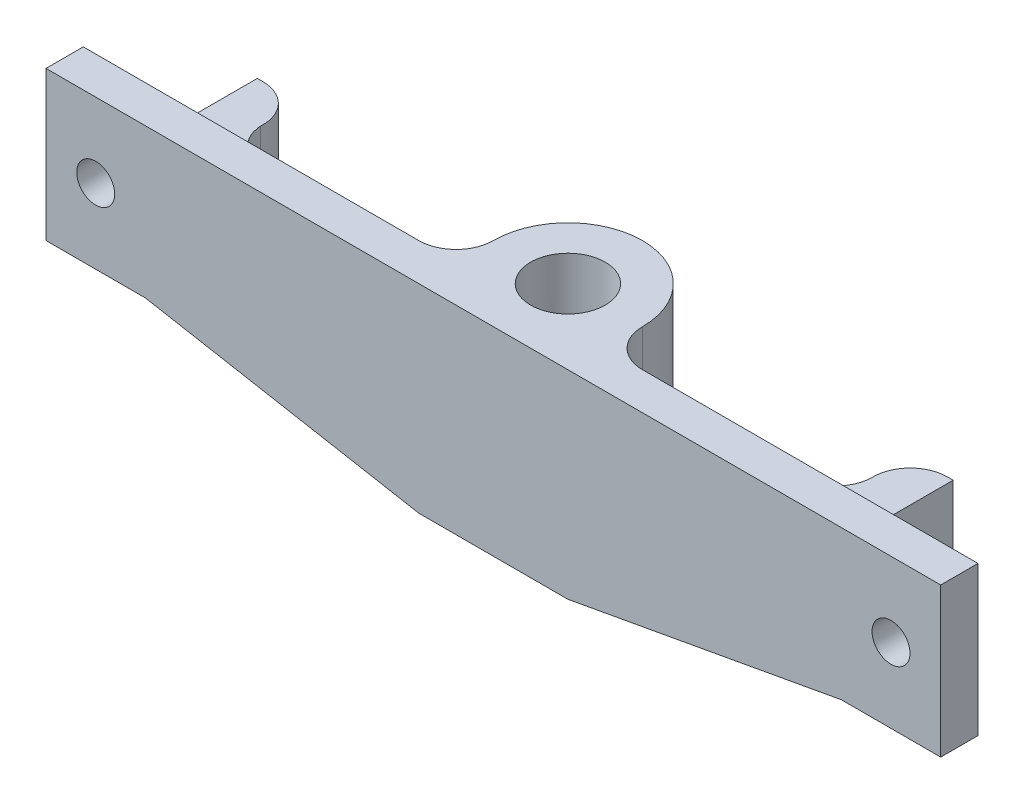
ISO-10303-21;
HEADER;
FILE_DESCRIPTION(('STEP AP214'),'2;1');
FILE_NAME('part.step','',(''),(''),'','','');
FILE_SCHEMA(('AUTOMOTIVE_DESIGN { 1 0 10303 214 1 1 1 1 }'));
ENDSEC;
DATA;
#1=APPLICATION_CONTEXT('core data for automotive mechanical design processes');
#2=APPLICATION_PROTOCOL_DEFINITION('international standard','automotive_design',2000,#1);
#3=PRODUCT_CONTEXT('',#1,'mechanical');
#4=PRODUCT('Part','Part','',(#3));
#5=PRODUCT_RELATED_PRODUCT_CATEGORY('part','',(#4));
#6=PRODUCT_DEFINITION_FORMATION('','',#4);
#7=PRODUCT_DEFINITION_CONTEXT('part definition',#1,'design');
#8=PRODUCT_DEFINITION('design','',#6,#7);
#9=PRODUCT_DEFINITION_SHAPE('','',#8);
#10=(LENGTH_UNIT() NAMED_UNIT(*) SI_UNIT(.MILLI.,.METRE.));
#11=(NAMED_UNIT(*) PLANE_ANGLE_UNIT() SI_UNIT($,.RADIAN.));
#12=(NAMED_UNIT(*) SI_UNIT($,.STERADIAN.) SOLID_ANGLE_UNIT());
#13=UNCERTAINTY_MEASURE_WITH_UNIT(LENGTH_MEASURE(1.E-05),#10,'distance_accuracy_value','');
#14=(GEOMETRIC_REPRESENTATION_CONTEXT(3) GLOBAL_UNCERTAINTY_ASSIGNED_CONTEXT((#13)) GLOBAL_UNIT_ASSIGNED_CONTEXT((#10,
#11,#12)) REPRESENTATION_CONTEXT('',''));
#15=CARTESIAN_POINT('',(0.,0.,0.));
#16=DIRECTION('',(0.,0.,1.));
#17=DIRECTION('',(1.,0.,0.));
#18=AXIS2_PLACEMENT_3D('',#15,#16,#17);
#19=CARTESIAN_POINT('',(0.,0.,0.));
#20=DIRECTION('',(0.,0.,-1.));
#21=DIRECTION('',(-1.,0.,0.));
#22=AXIS2_PLACEMENT_3D('',#19,#20,#21);
#23=PLANE('',#22);
#24=CARTESIAN_POINT('',(-50.8,-9.52499999999999,0.));
#25=DIRECTION('',(0.,0.,-1.));
#26=DIRECTION('',(-1.,0.,0.));
#27=AXIS2_PLACEMENT_3D('',#24,#25,#26);
#28=CIRCLE('',#27,2.4257);
#29=CARTESIAN_POINT('',(-53.2257,-9.52499999999999,0.));
#30=VERTEX_POINT('',#29);
#31=EDGE_CURVE('E282',#30,#30,#28,.T.);
#32=ORIENTED_EDGE('',*,*,#31,.F.);
#33=EDGE_LOOP('',(#32));
#34=FACE_BOUND('',#33,.T.);
#35=DIRECTION('',(-1.,0.,0.));
#36=VECTOR('',#35,1.);
#37=CARTESIAN_POINT('',(-57.15,0.,0.));
#38=LINE('',#37,#36);
#39=CARTESIAN_POINT('',(-14.2875,0.,0.));
#40=VERTEX_POINT('',#39);
#41=CARTESIAN_POINT('',(-57.15,0.,0.));
#42=VERTEX_POINT('',#41);
#43=EDGE_CURVE('E307',#40,#42,#38,.T.);
#44=ORIENTED_EDGE('',*,*,#43,.F.);
#45=DIRECTION('',(0.,-1.,0.));
#46=VECTOR('',#45,1.);
#47=CARTESIAN_POINT('',(-14.2875,-25.4,0.));
#48=LINE('',#47,#46);
#49=CARTESIAN_POINT('',(-14.2875,-24.5340909090909,0.));
#50=VERTEX_POINT('',#49);
#51=EDGE_CURVE('E342',#40,#50,#48,.T.);
#52=ORIENTED_EDGE('',*,*,#51,.T.);
#53=DIRECTION('',(0.983869910099907,-0.178885438199983,0.));
#54=VECTOR('',#53,1.);
#55=CARTESIAN_POINT('',(-44.45,-19.05,0.));
#56=LINE('',#55,#54);
#57=CARTESIAN_POINT('',(-44.45,-19.05,0.));
#58=VERTEX_POINT('',#57);
#59=EDGE_CURVE('E315',#58,#50,#56,.T.);
#60=ORIENTED_EDGE('',*,*,#59,.F.);
#61=DIRECTION('',(1.,0.,0.));
#62=VECTOR('',#61,1.);
#63=CARTESIAN_POINT('',(-57.15,-19.05,0.));
#64=LINE('',#63,#62);
#65=CARTESIAN_POINT('',(-57.15,-19.05,0.));
#66=VERTEX_POINT('',#65);
#67=EDGE_CURVE('E313',#66,#58,#64,.T.);
#68=ORIENTED_EDGE('',*,*,#67,.F.);
#69=DIRECTION('',(0.,-1.,0.));
#70=VECTOR('',#69,1.);
#71=CARTESIAN_POINT('',(-57.15,0.,0.));
#72=LINE('',#71,#70);
#73=EDGE_CURVE('E311',#42,#66,#72,.T.);
#74=ORIENTED_EDGE('',*,*,#73,.F.);
#75=EDGE_LOOP('',(#44,#52,#60,#68,#74));
#76=FACE_BOUND('',#75,.T.);
#77=DIRECTION('',(0.,1.,0.));
#78=VECTOR('',#77,1.);
#79=CARTESIAN_POINT('',(-44.45,-17.145,0.));
#80=LINE('',#79,#78);
#81=CARTESIAN_POINT('',(-44.45,-17.145,0.));
#82=VERTEX_POINT('',#81);
#83=CARTESIAN_POINT('',(-44.45,-1.905,0.));
#84=VERTEX_POINT('',#83);
#85=EDGE_CURVE('E48',#82,#84,#80,.T.);
#86=ORIENTED_EDGE('',*,*,#85,.F.);
#87=DIRECTION('',(1.,0.,0.));
#88=VECTOR('',#87,1.);
#89=CARTESIAN_POINT('',(-44.45,-17.145,0.));
#90=LINE('',#89,#88);
#91=CARTESIAN_POINT('',(-34.2183705090185,-17.145,0.));
#92=VERTEX_POINT('',#91);
#93=EDGE_CURVE('E52',#82,#92,#90,.T.);
#94=ORIENTED_EDGE('',*,*,#93,.T.);
#95=DIRECTION('',(0.,1.,0.));
#96=VECTOR('',#95,1.);
#97=CARTESIAN_POINT('',(-34.2183705090183,-17.145,0.));
#98=LINE('',#97,#96);
#99=CARTESIAN_POINT('',(-34.2183705090183,-1.905,0.));
#100=VERTEX_POINT('',#99);
#101=EDGE_CURVE('E202',#92,#100,#98,.T.);
#102=ORIENTED_EDGE('',*,*,#101,.T.);
#103=DIRECTION('',(1.,0.,0.));
#104=VECTOR('',#103,1.);
#105=CARTESIAN_POINT('',(-44.45,-1.905,0.));
#106=LINE('',#105,#104);
#107=EDGE_CURVE('E203',#84,#100,#106,.T.);
#108=ORIENTED_EDGE('',*,*,#107,.F.);
#109=EDGE_LOOP('',(#86,#94,#102,#108));
#110=FACE_BOUND('',#109,.T.);
#111=ADVANCED_FACE('F33',(#34,#76,#110),#23,.T.);
#112=DIRECTION('',(0.983869910099907,0.178885438199983,0.));
#113=VECTOR('',#112,1.);
#114=CARTESIAN_POINT('',(9.52500000000001,-25.4,0.));
#115=LINE('',#114,#113);
#116=CARTESIAN_POINT('',(14.2875,-24.5340909090909,0.));
#117=VERTEX_POINT('',#116);
#118=CARTESIAN_POINT('',(44.45,-19.05,0.));
#119=VERTEX_POINT('',#118);
#120=EDGE_CURVE('E318',#117,#119,#115,.T.);
#121=ORIENTED_EDGE('',*,*,#120,.F.);
#122=DIRECTION('',(0.,-1.,0.));
#123=VECTOR('',#122,1.);
#124=CARTESIAN_POINT('',(14.2875,0.,0.));
#125=LINE('',#124,#123);
#126=CARTESIAN_POINT('',(14.2875,0.,0.));
#127=VERTEX_POINT('',#126);
#128=EDGE_CURVE('E347',#117,#127,#125,.F.);
#129=ORIENTED_EDGE('',*,*,#128,.T.);
#130=CARTESIAN_POINT('',(57.15,0.,0.));
#131=VERTEX_POINT('',#130);
#132=EDGE_CURVE('E308',#131,#127,#38,.T.);
#133=ORIENTED_EDGE('',*,*,#132,.F.);
#134=DIRECTION('',(0.,1.,0.));
#135=VECTOR('',#134,1.);
#136=CARTESIAN_POINT('',(57.15,0.,0.));
#137=LINE('',#136,#135);
#138=CARTESIAN_POINT('',(57.15,-19.05,0.));
#139=VERTEX_POINT('',#138);
#140=EDGE_CURVE('E285',#139,#131,#137,.T.);
#141=ORIENTED_EDGE('',*,*,#140,.F.);
#142=DIRECTION('',(1.,0.,0.));
#143=VECTOR('',#142,1.);
#144=CARTESIAN_POINT('',(57.15,-19.05,0.));
#145=LINE('',#144,#143);
#146=EDGE_CURVE('E290',#119,#139,#145,.T.);
#147=ORIENTED_EDGE('',*,*,#146,.F.);
#148=EDGE_LOOP('',(#121,#129,#133,#141,#147));
#149=FACE_BOUND('',#148,.T.);
#150=CARTESIAN_POINT('',(50.8,-9.52499999999999,0.));
#151=DIRECTION('',(0.,0.,-1.));
#152=DIRECTION('',(-1.,0.,0.));
#153=AXIS2_PLACEMENT_3D('',#150,#151,#152);
#154=CIRCLE('',#153,2.4257);
#155=CARTESIAN_POINT('',(48.3743,-9.52499999999999,0.));
#156=VERTEX_POINT('',#155);
#157=EDGE_CURVE('E276',#156,#156,#154,.T.);
#158=ORIENTED_EDGE('',*,*,#157,.F.);
#159=EDGE_LOOP('',(#158));
#160=FACE_BOUND('',#159,.T.);
#161=DIRECTION('',(0.,1.,0.));
#162=VECTOR('',#161,1.);
#163=CARTESIAN_POINT('',(34.2183705090183,-17.145,0.));
#164=LINE('',#163,#162);
#165=CARTESIAN_POINT('',(34.2183705090185,-17.145,0.));
#166=VERTEX_POINT('',#165);
#167=CARTESIAN_POINT('',(34.2183705090183,-1.905,0.));
#168=VERTEX_POINT('',#167);
#169=EDGE_CURVE('E254',#166,#168,#164,.T.);
#170=ORIENTED_EDGE('',*,*,#169,.F.);
#171=DIRECTION('',(-1.,0.,0.));
#172=VECTOR('',#171,1.);
#173=CARTESIAN_POINT('',(44.45,-17.145,0.));
#174=LINE('',#173,#172);
#175=CARTESIAN_POINT('',(44.45,-17.145,0.));
#176=VERTEX_POINT('',#175);
#177=EDGE_CURVE('E221',#176,#166,#174,.T.);
#178=ORIENTED_EDGE('',*,*,#177,.F.);
#179=DIRECTION('',(0.,1.,0.));
#180=VECTOR('',#179,1.);
#181=CARTESIAN_POINT('',(44.45,-17.145,0.));
#182=LINE('',#181,#180);
#183=CARTESIAN_POINT('',(44.45,-1.905,0.));
#184=VERTEX_POINT('',#183);
#185=EDGE_CURVE('E234',#176,#184,#182,.T.);
#186=ORIENTED_EDGE('',*,*,#185,.T.);
#187=DIRECTION('',(-1.,0.,0.));
#188=VECTOR('',#187,1.);
#189=CARTESIAN_POINT('',(44.45,-1.905,0.));
#190=LINE('',#189,#188);
#191=EDGE_CURVE('E220',#184,#168,#190,.T.);
#192=ORIENTED_EDGE('',*,*,#191,.T.);
#193=EDGE_LOOP('',(#170,#178,#186,#192));
#194=FACE_BOUND('',#193,.T.);
#195=ADVANCED_FACE('F365',(#149,#160,#194),#23,.T.);
#196=CARTESIAN_POINT('',(0.,0.,4.7625));
#197=DIRECTION('',(0.,0.,-1.));
#198=DIRECTION('',(-1.,0.,0.));
#199=AXIS2_PLACEMENT_3D('',#196,#197,#198);
#200=PLANE('',#199);
#201=DIRECTION('',(0.,1.,0.));
#202=VECTOR('',#201,1.);
#203=CARTESIAN_POINT('',(57.15,0.,4.7625));
#204=LINE('',#203,#202);
#205=CARTESIAN_POINT('',(57.15,-19.05,4.7625));
#206=VERTEX_POINT('',#205);
#207=CARTESIAN_POINT('',(57.15,0.,4.7625));
#208=VERTEX_POINT('',#207);
#209=EDGE_CURVE('E286',#206,#208,#204,.T.);
#210=ORIENTED_EDGE('',*,*,#209,.T.);
#211=DIRECTION('',(-1.,0.,0.));
#212=VECTOR('',#211,1.);
#213=CARTESIAN_POINT('',(-57.15,0.,4.7625));
#214=LINE('',#213,#212);
#215=CARTESIAN_POINT('',(-57.15,0.,4.7625));
#216=VERTEX_POINT('',#215);
#217=EDGE_CURVE('E289',#208,#216,#214,.T.);
#218=ORIENTED_EDGE('',*,*,#217,.T.);
#219=DIRECTION('',(0.,-1.,0.));
#220=VECTOR('',#219,1.);
#221=CARTESIAN_POINT('',(-57.15,0.,4.7625));
#222=LINE('',#221,#220);
#223=CARTESIAN_POINT('',(-57.15,-19.05,4.7625));
#224=VERTEX_POINT('',#223);
#225=EDGE_CURVE('E292',#216,#224,#222,.T.);
#226=ORIENTED_EDGE('',*,*,#225,.T.);
#227=DIRECTION('',(1.,0.,0.));
#228=VECTOR('',#227,1.);
#229=CARTESIAN_POINT('',(-57.15,-19.05,4.7625));
#230=LINE('',#229,#228);
#231=CARTESIAN_POINT('',(-44.45,-19.05,4.7625));
#232=VERTEX_POINT('',#231);
#233=EDGE_CURVE('E294',#224,#232,#230,.T.);
#234=ORIENTED_EDGE('',*,*,#233,.T.);
#235=DIRECTION('',(0.983869910099907,-0.178885438199983,0.));
#236=VECTOR('',#235,1.);
#237=CARTESIAN_POINT('',(-44.45,-19.05,4.7625));
#238=LINE('',#237,#236);
#239=CARTESIAN_POINT('',(-9.525,-25.4,4.7625));
#240=VERTEX_POINT('',#239);
#241=EDGE_CURVE('E296',#232,#240,#238,.T.);
#242=ORIENTED_EDGE('',*,*,#241,.T.);
#243=DIRECTION('',(1.,0.,0.));
#244=VECTOR('',#243,1.);
#245=CARTESIAN_POINT('',(-9.525,-25.4,4.7625));
#246=LINE('',#245,#244);
#247=CARTESIAN_POINT('',(9.52500000000001,-25.4,4.7625));
#248=VERTEX_POINT('',#247);
#249=EDGE_CURVE('E298',#240,#248,#246,.T.);
#250=ORIENTED_EDGE('',*,*,#249,.T.);
#251=DIRECTION('',(0.983869910099907,0.178885438199983,0.));
#252=VECTOR('',#251,1.);
#253=CARTESIAN_POINT('',(9.52500000000001,-25.4,4.7625));
#254=LINE('',#253,#252);
#255=CARTESIAN_POINT('',(44.45,-19.05,4.7625));
#256=VERTEX_POINT('',#255);
#257=EDGE_CURVE('E300',#248,#256,#254,.T.);
#258=ORIENTED_EDGE('',*,*,#257,.T.);
#259=DIRECTION('',(1.,0.,0.));
#260=VECTOR('',#259,1.);
#261=CARTESIAN_POINT('',(57.15,-19.05,4.7625));
#262=LINE('',#261,#260);
#263=EDGE_CURVE('E302',#256,#206,#262,.T.);
#264=ORIENTED_EDGE('',*,*,#263,.T.);
#265=EDGE_LOOP('',(#210,#218,#226,#234,#242,#250,#258,#264));
#266=FACE_BOUND('',#265,.T.);
#267=CARTESIAN_POINT('',(-50.8,-9.52499999999999,4.7625));
#268=DIRECTION('',(0.,0.,1.));
#269=DIRECTION('',(1.,0.,0.));
#270=AXIS2_PLACEMENT_3D('',#267,#268,#269);
#271=CIRCLE('',#270,2.4257);
#272=CARTESIAN_POINT('',(-48.3743,-9.52499999999999,4.7625));
#273=VERTEX_POINT('',#272);
#274=EDGE_CURVE('E279',#273,#273,#271,.T.);
#275=ORIENTED_EDGE('',*,*,#274,.F.);
#276=EDGE_LOOP('',(#275));
#277=FACE_BOUND('',#276,.T.);
#278=CARTESIAN_POINT('',(50.8,-9.52499999999999,4.7625));
#279=DIRECTION('',(0.,0.,1.));
#280=DIRECTION('',(1.,0.,0.));
#281=AXIS2_PLACEMENT_3D('',#278,#279,#280);
#282=CIRCLE('',#281,2.4257);
#283=CARTESIAN_POINT('',(53.2257,-9.52499999999999,4.7625));
#284=VERTEX_POINT('',#283);
#285=EDGE_CURVE('E271',#284,#284,#282,.T.);
#286=ORIENTED_EDGE('',*,*,#285,.F.);
#287=EDGE_LOOP('',(#286));
#288=FACE_BOUND('',#287,.T.);
#289=ADVANCED_FACE('F395',(#266,#277,#288),#200,.F.);
#290=CARTESIAN_POINT('',(57.15,0.,4.7625));
#291=DIRECTION('',(-1.,0.,0.));
#292=DIRECTION('',(0.,0.,1.));
#293=AXIS2_PLACEMENT_3D('',#290,#291,#292);
#294=PLANE('',#293);
#295=ORIENTED_EDGE('',*,*,#140,.T.);
#296=DIRECTION('',(0.,0.,-1.));
#297=VECTOR('',#296,1.);
#298=CARTESIAN_POINT('',(57.15,0.,4.7625));
#299=LINE('',#298,#297);
#300=EDGE_CURVE('E339',#208,#131,#299,.T.);
#301=ORIENTED_EDGE('',*,*,#300,.F.);
#302=ORIENTED_EDGE('',*,*,#209,.F.);
#303=DIRECTION('',(0.,0.,-1.));
#304=VECTOR('',#303,1.);
#305=CARTESIAN_POINT('',(57.15,-19.05,4.7625));
#306=LINE('',#305,#304);
#307=EDGE_CURVE('E304',#206,#139,#306,.T.);
#308=ORIENTED_EDGE('',*,*,#307,.T.);
#309=EDGE_LOOP('',(#295,#301,#302,#308));
#310=FACE_BOUND('',#309,.T.);
#311=ADVANCED_FACE('F401',(#310),#294,.F.);
#312=CARTESIAN_POINT('',(-57.15,0.,4.7625));
#313=DIRECTION('',(0.,-1.,0.));
#314=DIRECTION('',(1.,0.,0.));
#315=AXIS2_PLACEMENT_3D('',#312,#313,#314);
#316=PLANE('',#315);
#317=CARTESIAN_POINT('',(0.,0.,-4.7625));
#318=DIRECTION('',(0.,-1.,0.));
#319=DIRECTION('',(1.,0.,0.));
#320=AXIS2_PLACEMENT_3D('',#317,#318,#319);
#321=CIRCLE('',#320,4.7625);
#322=CARTESIAN_POINT('',(4.7625,0.,-4.7625));
#323=VERTEX_POINT('',#322);
#324=EDGE_CURVE('E257',#323,#323,#321,.T.);
#325=ORIENTED_EDGE('',*,*,#324,.T.);
#326=EDGE_LOOP('',(#325));
#327=FACE_BOUND('',#326,.T.);
#328=ORIENTED_EDGE('',*,*,#132,.T.);
#329=CARTESIAN_POINT('',(14.2875,0.,-4.7625));
#330=DIRECTION('',(0.,-1.,0.));
#331=DIRECTION('',(1.,0.,0.));
#332=AXIS2_PLACEMENT_3D('',#329,#330,#331);
#333=CIRCLE('',#332,4.7625);
#334=CARTESIAN_POINT('',(9.525,0.,-4.7625));
#335=VERTEX_POINT('',#334);
#336=EDGE_CURVE('E11',#127,#335,#333,.T.);
#337=ORIENTED_EDGE('',*,*,#336,.T.);
#338=CARTESIAN_POINT('',(0.,0.,-4.7625));
#339=DIRECTION('',(0.,-1.,0.));
#340=DIRECTION('',(1.,0.,0.));
#341=AXIS2_PLACEMENT_3D('',#338,#339,#340);
#342=CIRCLE('',#341,9.525);
#343=CARTESIAN_POINT('',(-9.525,0.,-4.7625));
#344=VERTEX_POINT('',#343);
#345=EDGE_CURVE('E261',#344,#335,#342,.T.);
#346=ORIENTED_EDGE('',*,*,#345,.F.);
#347=CARTESIAN_POINT('',(-14.2875,0.,-4.7625));
#348=DIRECTION('',(0.,-1.,0.));
#349=DIRECTION('',(1.,0.,0.));
#350=AXIS2_PLACEMENT_3D('',#347,#348,#349);
#351=CIRCLE('',#350,4.7625);
#352=EDGE_CURVE('E352',#344,#40,#351,.T.);
#353=ORIENTED_EDGE('',*,*,#352,.T.);
#354=ORIENTED_EDGE('',*,*,#43,.T.);
#355=DIRECTION('',(0.,0.,-1.));
#356=VECTOR('',#355,1.);
#357=CARTESIAN_POINT('',(-57.15,0.,4.7625));
#358=LINE('',#357,#356);
#359=EDGE_CURVE('E336',#216,#42,#358,.T.);
#360=ORIENTED_EDGE('',*,*,#359,.F.);
#361=ORIENTED_EDGE('',*,*,#217,.F.);
#362=ORIENTED_EDGE('',*,*,#300,.T.);
#363=EDGE_LOOP('',(#328,#337,#346,#353,#354,#360,#361,#362));
#364=FACE_BOUND('',#363,.T.);
#365=ADVANCED_FACE('F371',(#327,#364),#316,.F.);
#366=CARTESIAN_POINT('',(-57.15,0.,4.7625));
#367=DIRECTION('',(1.,0.,0.));
#368=DIRECTION('',(0.,0.,-1.));
#369=AXIS2_PLACEMENT_3D('',#366,#367,#368);
#370=PLANE('',#369);
#371=ORIENTED_EDGE('',*,*,#73,.T.);
#372=DIRECTION('',(0.,0.,-1.));
#373=VECTOR('',#372,1.);
#374=CARTESIAN_POINT('',(-57.15,-19.05,4.7625));
#375=LINE('',#374,#373);
#376=EDGE_CURVE('E333',#224,#66,#375,.T.);
#377=ORIENTED_EDGE('',*,*,#376,.F.);
#378=ORIENTED_EDGE('',*,*,#225,.F.);
#379=ORIENTED_EDGE('',*,*,#359,.T.);
#380=EDGE_LOOP('',(#371,#377,#378,#379));
#381=FACE_BOUND('',#380,.T.);
#382=ADVANCED_FACE('F387',(#381),#370,.F.);
#383=CARTESIAN_POINT('',(-57.15,-19.05,4.7625));
#384=DIRECTION('',(0.,1.,0.));
#385=DIRECTION('',(-1.,0.,0.));
#386=AXIS2_PLACEMENT_3D('',#383,#384,#385);
#387=PLANE('',#386);
#388=ORIENTED_EDGE('',*,*,#67,.T.);
#389=DIRECTION('',(0.,0.,-1.));
#390=VECTOR('',#389,1.);
#391=CARTESIAN_POINT('',(-44.45,-19.05,4.7625));
#392=LINE('',#391,#390);
#393=EDGE_CURVE('E330',#232,#58,#392,.T.);
#394=ORIENTED_EDGE('',*,*,#393,.F.);
#395=ORIENTED_EDGE('',*,*,#233,.F.);
#396=ORIENTED_EDGE('',*,*,#376,.T.);
#397=EDGE_LOOP('',(#388,#394,#395,#396));
#398=FACE_BOUND('',#397,.T.);
#399=ADVANCED_FACE('F391',(#398),#387,.F.);
#400=CARTESIAN_POINT('',(-44.45,-19.05,4.7625));
#401=DIRECTION('',(0.178885438199983,0.983869910099908,0.));
#402=DIRECTION('',(-0.983869910099907,0.178885438199983,0.));
#403=AXIS2_PLACEMENT_3D('',#400,#401,#402);
#404=PLANE('',#403);
#405=ORIENTED_EDGE('',*,*,#59,.T.);
#406=CARTESIAN_POINT('',(-14.2875,-24.5340909090909,-4.7625));
#407=DIRECTION('',(0.178885438199983,0.983869910099908,0.));
#408=DIRECTION('',(-0.983869910099907,0.178885438199983,0.));
#409=AXIS2_PLACEMENT_3D('',#406,#407,#408);
#410=ELLIPSE('',#409,4.84057897401943,4.7625);
#411=CARTESIAN_POINT('',(-9.525,-25.4,-4.7625));
#412=VERTEX_POINT('',#411);
#413=EDGE_CURVE('E349',#50,#412,#410,.T.);
#414=ORIENTED_EDGE('',*,*,#413,.T.);
#415=DIRECTION('',(0.,0.,-1.));
#416=VECTOR('',#415,1.);
#417=CARTESIAN_POINT('',(-9.525,-25.4,4.7625));
#418=LINE('',#417,#416);
#419=EDGE_CURVE('E328',#240,#412,#418,.T.);
#420=ORIENTED_EDGE('',*,*,#419,.F.);
#421=ORIENTED_EDGE('',*,*,#241,.F.);
#422=ORIENTED_EDGE('',*,*,#393,.T.);
#423=EDGE_LOOP('',(#405,#414,#420,#421,#422));
#424=FACE_BOUND('',#423,.T.);
#425=ADVANCED_FACE('F410',(#424),#404,.F.);
#426=CARTESIAN_POINT('',(-9.525,-25.4,4.7625));
#427=DIRECTION('',(0.,1.,0.));
#428=DIRECTION('',(-1.,0.,0.));
#429=AXIS2_PLACEMENT_3D('',#426,#427,#428);
#430=PLANE('',#429);
#431=CARTESIAN_POINT('',(0.,-25.4,-4.7625));
#432=DIRECTION('',(0.,1.,0.));
#433=DIRECTION('',(-1.,0.,0.));
#434=AXIS2_PLACEMENT_3D('',#431,#432,#433);
#435=CIRCLE('',#434,4.7625);
#436=CARTESIAN_POINT('',(-4.7625,-25.4,-4.7625));
#437=VERTEX_POINT('',#436);
#438=EDGE_CURVE('E260',#437,#437,#435,.T.);
#439=ORIENTED_EDGE('',*,*,#438,.T.);
#440=EDGE_LOOP('',(#439));
#441=FACE_BOUND('',#440,.T.);
#442=ORIENTED_EDGE('',*,*,#419,.T.);
#443=CARTESIAN_POINT('',(0.,-25.4,-4.7625));
#444=DIRECTION('',(0.,-1.,0.));
#445=DIRECTION('',(1.,0.,0.));
#446=AXIS2_PLACEMENT_3D('',#443,#444,#445);
#447=CIRCLE('',#446,9.525);
#448=CARTESIAN_POINT('',(9.52500000000001,-25.4,-4.7625));
#449=VERTEX_POINT('',#448);
#450=EDGE_CURVE('E265',#412,#449,#447,.T.);
#451=ORIENTED_EDGE('',*,*,#450,.T.);
#452=DIRECTION('',(0.,0.,-1.));
#453=VECTOR('',#452,1.);
#454=CARTESIAN_POINT('',(9.52500000000001,-25.4,4.7625));
#455=LINE('',#454,#453);
#456=EDGE_CURVE('E326',#248,#449,#455,.T.);
#457=ORIENTED_EDGE('',*,*,#456,.F.);
#458=ORIENTED_EDGE('',*,*,#249,.F.);
#459=EDGE_LOOP('',(#442,#451,#457,#458));
#460=FACE_BOUND('',#459,.T.);
#461=ADVANCED_FACE('F408',(#441,#460),#430,.F.);
#462=CARTESIAN_POINT('',(9.52500000000001,-25.4,4.7625));
#463=DIRECTION('',(-0.178885438199983,0.983869910099907,0.));
#464=DIRECTION('',(-0.983869910099908,-0.178885438199983,0.));
#465=AXIS2_PLACEMENT_3D('',#462,#463,#464);
#466=PLANE('',#465);
#467=ORIENTED_EDGE('',*,*,#456,.T.);
#468=CARTESIAN_POINT('',(14.2875,-24.5340909090909,-4.7625));
#469=DIRECTION('',(-0.178885438199983,0.983869910099907,0.));
#470=DIRECTION('',(0.983869910099908,0.178885438199983,0.));
#471=AXIS2_PLACEMENT_3D('',#468,#469,#470);
#472=ELLIPSE('',#471,4.84057897401943,4.7625);
#473=EDGE_CURVE('E41',#449,#117,#472,.T.);
#474=ORIENTED_EDGE('',*,*,#473,.T.);
#475=ORIENTED_EDGE('',*,*,#120,.T.);
#476=DIRECTION('',(0.,0.,-1.));
#477=VECTOR('',#476,1.);
#478=CARTESIAN_POINT('',(44.45,-19.05,4.7625));
#479=LINE('',#478,#477);
#480=EDGE_CURVE('E323',#256,#119,#479,.T.);
#481=ORIENTED_EDGE('',*,*,#480,.F.);
#482=ORIENTED_EDGE('',*,*,#257,.F.);
#483=EDGE_LOOP('',(#467,#474,#475,#481,#482));
#484=FACE_BOUND('',#483,.T.);
#485=ADVANCED_FACE('F356',(#484),#466,.F.);
#486=CARTESIAN_POINT('',(57.15,-19.05,4.7625));
#487=DIRECTION('',(0.,1.,0.));
#488=DIRECTION('',(0.,0.,1.));
#489=AXIS2_PLACEMENT_3D('',#486,#487,#488);
#490=PLANE('',#489);
#491=ORIENTED_EDGE('',*,*,#146,.T.);
#492=ORIENTED_EDGE('',*,*,#307,.F.);
#493=ORIENTED_EDGE('',*,*,#263,.F.);
#494=ORIENTED_EDGE('',*,*,#480,.T.);
#495=EDGE_LOOP('',(#491,#492,#493,#494));
#496=FACE_BOUND('',#495,.T.);
#497=ADVANCED_FACE('F405',(#496),#490,.F.);
#498=CARTESIAN_POINT('',(-50.8,-9.52499999999999,4.7625));
#499=DIRECTION('',(0.,0.,1.));
#500=DIRECTION('',(1.,0.,0.));
#501=AXIS2_PLACEMENT_3D('',#498,#499,#500);
#502=CYLINDRICAL_SURFACE('',#501,2.4257);
#503=ORIENTED_EDGE('',*,*,#274,.T.);
#504=EDGE_LOOP('',(#503));
#505=FACE_BOUND('',#504,.T.);
#506=ORIENTED_EDGE('',*,*,#31,.T.);
#507=EDGE_LOOP('',(#506));
#508=FACE_BOUND('',#507,.T.);
#509=ADVANCED_FACE('F432',(#505,#508),#502,.F.);
#510=CARTESIAN_POINT('',(50.8,-9.52499999999999,4.7625));
#511=DIRECTION('',(0.,0.,1.));
#512=DIRECTION('',(1.,0.,0.));
#513=AXIS2_PLACEMENT_3D('',#510,#511,#512);
#514=CYLINDRICAL_SURFACE('',#513,2.4257);
#515=ORIENTED_EDGE('',*,*,#285,.T.);
#516=EDGE_LOOP('',(#515));
#517=FACE_BOUND('',#516,.T.);
#518=ORIENTED_EDGE('',*,*,#157,.T.);
#519=EDGE_LOOP('',(#518));
#520=FACE_BOUND('',#519,.T.);
#521=ADVANCED_FACE('F451',(#517,#520),#514,.F.);
#522=CARTESIAN_POINT('',(0.,0.,-4.7625));
#523=DIRECTION('',(0.,-1.,0.));
#524=DIRECTION('',(1.,0.,0.));
#525=AXIS2_PLACEMENT_3D('',#522,#523,#524);
#526=CYLINDRICAL_SURFACE('',#525,9.525);
#527=ORIENTED_EDGE('',*,*,#450,.F.);
#528=DIRECTION('',(0.,-1.,0.));
#529=VECTOR('',#528,1.);
#530=CARTESIAN_POINT('',(-9.525,0.,-4.7625));
#531=LINE('',#530,#529);
#532=EDGE_CURVE('E264',#344,#412,#531,.T.);
#533=ORIENTED_EDGE('',*,*,#532,.F.);
#534=ORIENTED_EDGE('',*,*,#345,.T.);
#535=DIRECTION('',(0.,-1.,0.));
#536=VECTOR('',#535,1.);
#537=CARTESIAN_POINT('',(9.525,0.,-4.7625));
#538=LINE('',#537,#536);
#539=EDGE_CURVE('E268',#335,#449,#538,.T.);
#540=ORIENTED_EDGE('',*,*,#539,.T.);
#541=EDGE_LOOP('',(#527,#533,#534,#540));
#542=FACE_BOUND('',#541,.T.);
#543=ADVANCED_FACE('F375',(#542),#526,.T.);
#544=CARTESIAN_POINT('',(0.,0.,-4.7625));
#545=DIRECTION('',(0.,-1.,0.));
#546=DIRECTION('',(1.,0.,0.));
#547=AXIS2_PLACEMENT_3D('',#544,#545,#546);
#548=CYLINDRICAL_SURFACE('',#547,4.7625);
#549=ORIENTED_EDGE('',*,*,#324,.F.);
#550=EDGE_LOOP('',(#549));
#551=FACE_BOUND('',#550,.T.);
#552=ORIENTED_EDGE('',*,*,#438,.F.);
#553=EDGE_LOOP('',(#552));
#554=FACE_BOUND('',#553,.T.);
#555=ADVANCED_FACE('F465',(#551,#554),#548,.F.);
#556=CARTESIAN_POINT('',(-14.2875,0.,-4.7625));
#557=DIRECTION('',(0.,1.,0.));
#558=DIRECTION('',(-1.,0.,0.));
#559=AXIS2_PLACEMENT_3D('',#556,#557,#558);
#560=CYLINDRICAL_SURFACE('',#559,4.7625);
#561=ORIENTED_EDGE('',*,*,#352,.F.);
#562=ORIENTED_EDGE('',*,*,#532,.T.);
#563=ORIENTED_EDGE('',*,*,#413,.F.);
#564=ORIENTED_EDGE('',*,*,#51,.F.);
#565=EDGE_LOOP('',(#561,#562,#563,#564));
#566=FACE_BOUND('',#565,.T.);
#567=ADVANCED_FACE('F377',(#566),#560,.F.);
#568=CARTESIAN_POINT('',(14.2875,0.,-4.7625));
#569=DIRECTION('',(0.,1.,0.));
#570=DIRECTION('',(-1.,0.,0.));
#571=AXIS2_PLACEMENT_3D('',#568,#569,#570);
#572=CYLINDRICAL_SURFACE('',#571,4.7625);
#573=ORIENTED_EDGE('',*,*,#336,.F.);
#574=ORIENTED_EDGE('',*,*,#128,.F.);
#575=ORIENTED_EDGE('',*,*,#473,.F.);
#576=ORIENTED_EDGE('',*,*,#539,.F.);
#577=EDGE_LOOP('',(#573,#574,#575,#576));
#578=FACE_BOUND('',#577,.T.);
#579=ADVANCED_FACE('F35',(#578),#572,.F.);
#580=CARTESIAN_POINT('',(34.2183705090185,-17.145,-4.7625));
#581=DIRECTION('',(0.,1.,0.));
#582=DIRECTION('',(-1.,0.,0.));
#583=AXIS2_PLACEMENT_3D('',#580,#581,#582);
#584=CYLINDRICAL_SURFACE('',#583,4.7625);
#585=CARTESIAN_POINT('',(34.2183705090185,-1.905,-4.7625));
#586=DIRECTION('',(0.,1.,0.));
#587=DIRECTION('',(-1.,0.,0.));
#588=AXIS2_PLACEMENT_3D('',#585,#586,#587);
#589=CIRCLE('',#588,4.7625);
#590=CARTESIAN_POINT('',(38.9710470951382,-1.905,-4.45676887997779));
#591=VERTEX_POINT('',#590);
#592=EDGE_CURVE('E236',#168,#591,#589,.T.);
#593=ORIENTED_EDGE('',*,*,#592,.T.);
#594=DIRECTION('',(0.,1.,0.));
#595=VECTOR('',#594,1.);
#596=CARTESIAN_POINT('',(38.9710470951382,-17.145,-4.45676887997779));
#597=LINE('',#596,#595);
#598=CARTESIAN_POINT('',(38.9710470951382,-17.145,-4.45676887997779));
#599=VERTEX_POINT('',#598);
#600=EDGE_CURVE('E251',#599,#591,#597,.T.);
#601=ORIENTED_EDGE('',*,*,#600,.F.);
#602=CARTESIAN_POINT('',(34.2183705090185,-17.145,-4.7625));
#603=DIRECTION('',(0.,1.,0.));
#604=DIRECTION('',(-1.,0.,0.));
#605=AXIS2_PLACEMENT_3D('',#602,#603,#604);
#606=CIRCLE('',#605,4.7625);
#607=EDGE_CURVE('E224',#166,#599,#606,.T.);
#608=ORIENTED_EDGE('',*,*,#607,.F.);
#609=ORIENTED_EDGE('',*,*,#169,.T.);
#610=EDGE_LOOP('',(#593,#601,#608,#609));
#611=FACE_BOUND('',#610,.T.);
#612=ADVANCED_FACE('F484',(#611),#584,.F.);
#613=CARTESIAN_POINT('',(43.7237236812578,-17.145,-4.7625));
#614=DIRECTION('',(0.,1.,0.));
#615=DIRECTION('',(-1.,0.,0.));
#616=AXIS2_PLACEMENT_3D('',#613,#614,#615);
#617=CYLINDRICAL_SURFACE('',#616,4.7625);
#618=CARTESIAN_POINT('',(43.7237236812578,-1.905,-4.7625));
#619=DIRECTION('',(0.,-1.,0.));
#620=DIRECTION('',(-1.,0.,0.));
#621=AXIS2_PLACEMENT_3D('',#618,#619,#620);
#622=CIRCLE('',#621,4.7625);
#623=CARTESIAN_POINT('',(43.7237236812578,-1.905,-9.525));
#624=VERTEX_POINT('',#623);
#625=EDGE_CURVE('E238',#591,#624,#622,.T.);
#626=ORIENTED_EDGE('',*,*,#625,.T.);
#627=DIRECTION('',(0.,1.,0.));
#628=VECTOR('',#627,1.);
#629=CARTESIAN_POINT('',(43.7237236812578,-17.145,-9.525));
#630=LINE('',#629,#628);
#631=CARTESIAN_POINT('',(43.7237236812578,-17.145,-9.525));
#632=VERTEX_POINT('',#631);
#633=EDGE_CURVE('E248',#632,#624,#630,.T.);
#634=ORIENTED_EDGE('',*,*,#633,.F.);
#635=CARTESIAN_POINT('',(43.7237236812578,-17.145,-4.7625));
#636=DIRECTION('',(0.,-1.,0.));
#637=DIRECTION('',(-1.,0.,0.));
#638=AXIS2_PLACEMENT_3D('',#635,#636,#637);
#639=CIRCLE('',#638,4.7625);
#640=EDGE_CURVE('E227',#599,#632,#639,.T.);
#641=ORIENTED_EDGE('',*,*,#640,.F.);
#642=ORIENTED_EDGE('',*,*,#600,.T.);
#643=EDGE_LOOP('',(#626,#634,#641,#642));
#644=FACE_BOUND('',#643,.T.);
#645=ADVANCED_FACE('F491',(#644),#617,.T.);
#646=CARTESIAN_POINT('',(44.45,-17.145,-9.525));
#647=DIRECTION('',(0.,0.,1.));
#648=DIRECTION('',(1.,0.,0.));
#649=AXIS2_PLACEMENT_3D('',#646,#647,#648);
#650=PLANE('',#649);
#651=DIRECTION('',(1.,0.,0.));
#652=VECTOR('',#651,1.);
#653=CARTESIAN_POINT('',(44.45,-1.905,-9.525));
#654=LINE('',#653,#652);
#655=CARTESIAN_POINT('',(44.45,-1.905,-9.525));
#656=VERTEX_POINT('',#655);
#657=EDGE_CURVE('E240',#624,#656,#654,.T.);
#658=ORIENTED_EDGE('',*,*,#657,.T.);
#659=DIRECTION('',(0.,1.,0.));
#660=VECTOR('',#659,1.);
#661=CARTESIAN_POINT('',(44.45,-17.145,-9.525));
#662=LINE('',#661,#660);
#663=CARTESIAN_POINT('',(44.45,-17.145,-9.525));
#664=VERTEX_POINT('',#663);
#665=EDGE_CURVE('E245',#664,#656,#662,.T.);
#666=ORIENTED_EDGE('',*,*,#665,.F.);
#667=DIRECTION('',(1.,0.,0.));
#668=VECTOR('',#667,1.);
#669=CARTESIAN_POINT('',(44.45,-17.145,-9.525));
#670=LINE('',#669,#668);
#671=EDGE_CURVE('E229',#632,#664,#670,.T.);
#672=ORIENTED_EDGE('',*,*,#671,.F.);
#673=ORIENTED_EDGE('',*,*,#633,.T.);
#674=EDGE_LOOP('',(#658,#666,#672,#673));
#675=FACE_BOUND('',#674,.T.);
#676=ADVANCED_FACE('F499',(#675),#650,.F.);
#677=CARTESIAN_POINT('',(44.45,-17.145,0.));
#678=DIRECTION('',(-1.,0.,0.));
#679=DIRECTION('',(0.,-1.,0.));
#680=AXIS2_PLACEMENT_3D('',#677,#678,#679);
#681=PLANE('',#680);
#682=DIRECTION('',(0.,0.,1.));
#683=VECTOR('',#682,1.);
#684=CARTESIAN_POINT('',(44.45,-1.905,0.));
#685=LINE('',#684,#683);
#686=EDGE_CURVE('E225',#656,#184,#685,.T.);
#687=ORIENTED_EDGE('',*,*,#686,.T.);
#688=ORIENTED_EDGE('',*,*,#185,.F.);
#689=DIRECTION('',(0.,0.,1.));
#690=VECTOR('',#689,1.);
#691=CARTESIAN_POINT('',(44.45,-17.145,0.));
#692=LINE('',#691,#690);
#693=EDGE_CURVE('E231',#664,#176,#692,.T.);
#694=ORIENTED_EDGE('',*,*,#693,.F.);
#695=ORIENTED_EDGE('',*,*,#665,.T.);
#696=EDGE_LOOP('',(#687,#688,#694,#695));
#697=FACE_BOUND('',#696,.T.);
#698=ADVANCED_FACE('F507',(#697),#681,.F.);
#699=CARTESIAN_POINT('',(34.2183705090185,-17.145,-4.7625));
#700=DIRECTION('',(0.,1.,0.));
#701=DIRECTION('',(-1.,0.,0.));
#702=AXIS2_PLACEMENT_3D('',#699,#700,#701);
#703=PLANE('',#702);
#704=ORIENTED_EDGE('',*,*,#177,.T.);
#705=ORIENTED_EDGE('',*,*,#607,.T.);
#706=ORIENTED_EDGE('',*,*,#640,.T.);
#707=ORIENTED_EDGE('',*,*,#671,.T.);
#708=ORIENTED_EDGE('',*,*,#693,.T.);
#709=EDGE_LOOP('',(#704,#705,#706,#707,#708));
#710=FACE_BOUND('',#709,.T.);
#711=ADVANCED_FACE('F515',(#710),#703,.F.);
#712=CARTESIAN_POINT('',(34.2183705090185,-1.905,-4.7625));
#713=DIRECTION('',(0.,1.,0.));
#714=DIRECTION('',(-1.,0.,0.));
#715=AXIS2_PLACEMENT_3D('',#712,#713,#714);
#716=PLANE('',#715);
#717=ORIENTED_EDGE('',*,*,#191,.F.);
#718=ORIENTED_EDGE('',*,*,#686,.F.);
#719=ORIENTED_EDGE('',*,*,#657,.F.);
#720=ORIENTED_EDGE('',*,*,#625,.F.);
#721=ORIENTED_EDGE('',*,*,#592,.F.);
#722=EDGE_LOOP('',(#717,#718,#719,#720,#721));
#723=FACE_BOUND('',#722,.T.);
#724=ADVANCED_FACE('F523',(#723),#716,.T.);
#725=CARTESIAN_POINT('',(-44.45,-17.145,0.));
#726=DIRECTION('',(-1.,0.,0.));
#727=DIRECTION('',(0.,-1.,0.));
#728=AXIS2_PLACEMENT_3D('',#725,#726,#727);
#729=PLANE('',#728);
#730=DIRECTION('',(0.,0.,1.));
#731=VECTOR('',#730,1.);
#732=CARTESIAN_POINT('',(-44.45,-1.905,0.));
#733=LINE('',#732,#731);
#734=CARTESIAN_POINT('',(-44.45,-1.905,-9.525));
#735=VERTEX_POINT('',#734);
#736=EDGE_CURVE('E178',#735,#84,#733,.T.);
#737=ORIENTED_EDGE('',*,*,#736,.F.);
#738=DIRECTION('',(0.,1.,0.));
#739=VECTOR('',#738,1.);
#740=CARTESIAN_POINT('',(-44.45,-17.145,-9.525));
#741=LINE('',#740,#739);
#742=CARTESIAN_POINT('',(-44.45,-17.145,-9.525));
#743=VERTEX_POINT('',#742);
#744=EDGE_CURVE('E173',#743,#735,#741,.T.);
#745=ORIENTED_EDGE('',*,*,#744,.F.);
#746=DIRECTION('',(0.,0.,1.));
#747=VECTOR('',#746,1.);
#748=CARTESIAN_POINT('',(-44.45,-17.145,0.));
#749=LINE('',#748,#747);
#750=EDGE_CURVE('E176',#743,#82,#749,.T.);
#751=ORIENTED_EDGE('',*,*,#750,.T.);
#752=ORIENTED_EDGE('',*,*,#85,.T.);
#753=EDGE_LOOP('',(#737,#745,#751,#752));
#754=FACE_BOUND('',#753,.T.);
#755=ADVANCED_FACE('F175',(#754),#729,.T.);
#756=CARTESIAN_POINT('',(-44.45,-17.145,-9.525));
#757=DIRECTION('',(0.,0.,-1.));
#758=DIRECTION('',(-1.,0.,0.));
#759=AXIS2_PLACEMENT_3D('',#756,#757,#758);
#760=PLANE('',#759);
#761=DIRECTION('',(-1.,0.,0.));
#762=VECTOR('',#761,1.);
#763=CARTESIAN_POINT('',(-44.45,-1.905,-9.525));
#764=LINE('',#763,#762);
#765=CARTESIAN_POINT('',(-43.7237236812578,-1.905,-9.525));
#766=VERTEX_POINT('',#765);
#767=EDGE_CURVE('E207',#766,#735,#764,.T.);
#768=ORIENTED_EDGE('',*,*,#767,.F.);
#769=DIRECTION('',(0.,1.,0.));
#770=VECTOR('',#769,1.);
#771=CARTESIAN_POINT('',(-43.7237236812578,-17.145,-9.525));
#772=LINE('',#771,#770);
#773=CARTESIAN_POINT('',(-43.7237236812578,-17.145,-9.525));
#774=VERTEX_POINT('',#773);
#775=EDGE_CURVE('E183',#774,#766,#772,.T.);
#776=ORIENTED_EDGE('',*,*,#775,.F.);
#777=DIRECTION('',(-1.,0.,0.));
#778=VECTOR('',#777,1.);
#779=CARTESIAN_POINT('',(-44.45,-17.145,-9.525));
#780=LINE('',#779,#778);
#781=EDGE_CURVE('E189',#774,#743,#780,.T.);
#782=ORIENTED_EDGE('',*,*,#781,.T.);
#783=ORIENTED_EDGE('',*,*,#744,.T.);
#784=EDGE_LOOP('',(#768,#776,#782,#783));
#785=FACE_BOUND('',#784,.T.);
#786=ADVANCED_FACE('F193',(#785),#760,.T.);
#787=CARTESIAN_POINT('',(-43.7237236812578,-17.145,-4.7625));
#788=DIRECTION('',(0.,1.,0.));
#789=DIRECTION('',(-1.,0.,0.));
#790=AXIS2_PLACEMENT_3D('',#787,#788,#789);
#791=CYLINDRICAL_SURFACE('',#790,4.7625);
#792=CARTESIAN_POINT('',(-43.7237236812578,-1.905,-4.7625));
#793=DIRECTION('',(0.,1.,0.));
#794=DIRECTION('',(1.,0.,0.));
#795=AXIS2_PLACEMENT_3D('',#792,#793,#794);
#796=CIRCLE('',#795,4.7625);
#797=CARTESIAN_POINT('',(-38.9710470951382,-1.905,-4.45676887997779));
#798=VERTEX_POINT('',#797);
#799=EDGE_CURVE('E209',#798,#766,#796,.T.);
#800=ORIENTED_EDGE('',*,*,#799,.F.);
#801=DIRECTION('',(0.,1.,0.));
#802=VECTOR('',#801,1.);
#803=CARTESIAN_POINT('',(-38.9710470951382,-17.145,-4.45676887997779));
#804=LINE('',#803,#802);
#805=CARTESIAN_POINT('',(-38.9710470951382,-17.145,-4.45676887997779));
#806=VERTEX_POINT('',#805);
#807=EDGE_CURVE('E216',#806,#798,#804,.T.);
#808=ORIENTED_EDGE('',*,*,#807,.F.);
#809=CARTESIAN_POINT('',(-43.7237236812578,-17.145,-4.7625));
#810=DIRECTION('',(0.,1.,0.));
#811=DIRECTION('',(1.,0.,0.));
#812=AXIS2_PLACEMENT_3D('',#809,#810,#811);
#813=CIRCLE('',#812,4.7625);
#814=EDGE_CURVE('E194',#806,#774,#813,.T.);
#815=ORIENTED_EDGE('',*,*,#814,.T.);
#816=ORIENTED_EDGE('',*,*,#775,.T.);
#817=EDGE_LOOP('',(#800,#808,#815,#816));
#818=FACE_BOUND('',#817,.T.);
#819=ADVANCED_FACE('F544',(#818),#791,.T.);
#820=CARTESIAN_POINT('',(-34.2183705090185,-17.145,-4.7625));
#821=DIRECTION('',(0.,1.,0.));
#822=DIRECTION('',(-1.,0.,0.));
#823=AXIS2_PLACEMENT_3D('',#820,#821,#822);
#824=CYLINDRICAL_SURFACE('',#823,4.7625);
#825=CARTESIAN_POINT('',(-34.2183705090185,-1.905,-4.7625));
#826=DIRECTION('',(0.,-1.,0.));
#827=DIRECTION('',(1.,0.,0.));
#828=AXIS2_PLACEMENT_3D('',#825,#826,#827);
#829=CIRCLE('',#828,4.7625);
#830=EDGE_CURVE('E212',#100,#798,#829,.T.);
#831=ORIENTED_EDGE('',*,*,#830,.F.);
#832=ORIENTED_EDGE('',*,*,#101,.F.);
#833=CARTESIAN_POINT('',(-34.2183705090185,-17.145,-4.7625));
#834=DIRECTION('',(0.,-1.,0.));
#835=DIRECTION('',(1.,0.,0.));
#836=AXIS2_PLACEMENT_3D('',#833,#834,#835);
#837=CIRCLE('',#836,4.7625);
#838=EDGE_CURVE('E196',#92,#806,#837,.T.);
#839=ORIENTED_EDGE('',*,*,#838,.T.);
#840=ORIENTED_EDGE('',*,*,#807,.T.);
#841=EDGE_LOOP('',(#831,#832,#839,#840));
#842=FACE_BOUND('',#841,.T.);
#843=ADVANCED_FACE('F551',(#842),#824,.F.);
#844=CARTESIAN_POINT('',(-34.2183705090185,-17.145,-4.7625));
#845=DIRECTION('',(0.,1.,0.));
#846=DIRECTION('',(1.,0.,0.));
#847=AXIS2_PLACEMENT_3D('',#844,#845,#846);
#848=PLANE('',#847);
#849=ORIENTED_EDGE('',*,*,#93,.F.);
#850=ORIENTED_EDGE('',*,*,#750,.F.);
#851=ORIENTED_EDGE('',*,*,#781,.F.);
#852=ORIENTED_EDGE('',*,*,#814,.F.);
#853=ORIENTED_EDGE('',*,*,#838,.F.);
#854=EDGE_LOOP('',(#849,#850,#851,#852,#853));
#855=FACE_BOUND('',#854,.T.);
#856=ADVANCED_FACE('F187',(#855),#848,.F.);
#857=CARTESIAN_POINT('',(-34.2183705090185,-1.905,-4.7625));
#858=DIRECTION('',(0.,1.,0.));
#859=DIRECTION('',(1.,0.,0.));
#860=AXIS2_PLACEMENT_3D('',#857,#858,#859);
#861=PLANE('',#860);
#862=ORIENTED_EDGE('',*,*,#107,.T.);
#863=ORIENTED_EDGE('',*,*,#830,.T.);
#864=ORIENTED_EDGE('',*,*,#799,.T.);
#865=ORIENTED_EDGE('',*,*,#767,.T.);
#866=ORIENTED_EDGE('',*,*,#736,.T.);
#867=EDGE_LOOP('',(#862,#863,#864,#865,#866));
#868=FACE_BOUND('',#867,.T.);
#869=ADVANCED_FACE('F566',(#868),#861,.T.);
#870=CLOSED_SHELL('',(#111,#195,#289,#311,#365,#382,#399,#425,#461,#485,#497,#509,#521,#543,
#555,#567,#579,#612,#645,#676,#698,#711,#724,#755,#786,#819,#843,#856,#869));
#871=MANIFOLD_SOLID_BREP('B2',#870);
#872=ADVANCED_BREP_SHAPE_REPRESENTATION('',(#18,#871),#14);
#873=SHAPE_DEFINITION_REPRESENTATION(#9,#872);
ENDSEC;
END-ISO-10303-21;
